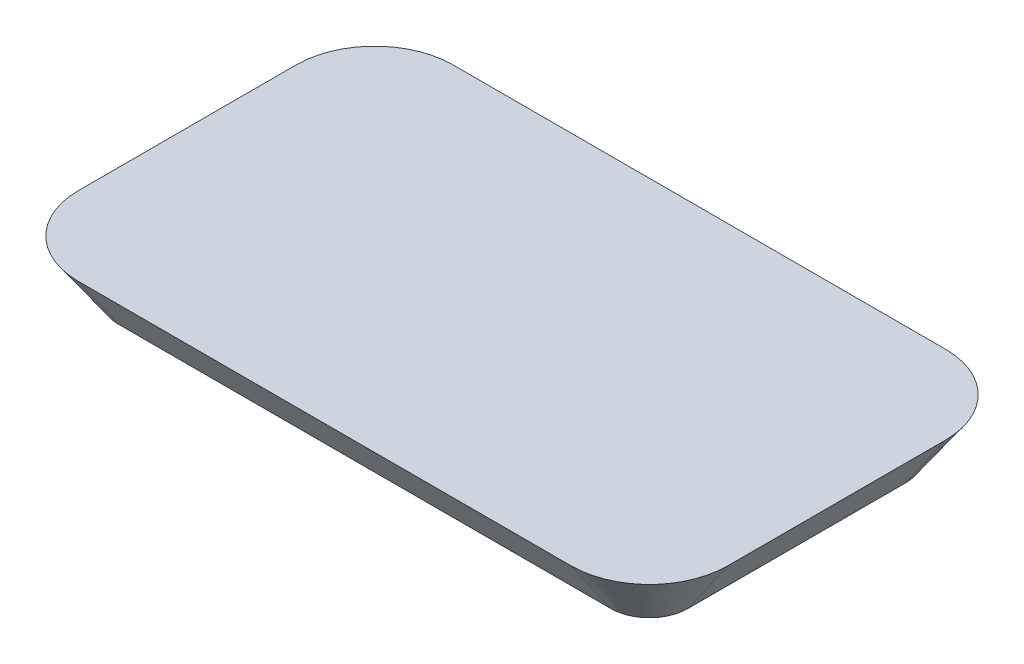
ISO-10303-21;
HEADER;
FILE_DESCRIPTION(('STEP AP214'),'2;1');
FILE_NAME('part.step','',(''),(''),'','','');
FILE_SCHEMA(('AUTOMOTIVE_DESIGN { 1 0 10303 214 1 1 1 1 }'));
ENDSEC;
DATA;
#1=APPLICATION_CONTEXT('core data for automotive mechanical design processes');
#2=APPLICATION_PROTOCOL_DEFINITION('international standard','automotive_design',2000,#1);
#3=PRODUCT_CONTEXT('',#1,'mechanical');
#4=PRODUCT('Part','Part','',(#3));
#5=PRODUCT_RELATED_PRODUCT_CATEGORY('part','',(#4));
#6=PRODUCT_DEFINITION_FORMATION('','',#4);
#7=PRODUCT_DEFINITION_CONTEXT('part definition',#1,'design');
#8=PRODUCT_DEFINITION('design','',#6,#7);
#9=PRODUCT_DEFINITION_SHAPE('','',#8);
#10=(LENGTH_UNIT() NAMED_UNIT(*) SI_UNIT(.MILLI.,.METRE.));
#11=(NAMED_UNIT(*) PLANE_ANGLE_UNIT() SI_UNIT($,.RADIAN.));
#12=(NAMED_UNIT(*) SI_UNIT($,.STERADIAN.) SOLID_ANGLE_UNIT());
#13=UNCERTAINTY_MEASURE_WITH_UNIT(LENGTH_MEASURE(1.E-05),#10,'distance_accuracy_value','');
#14=(GEOMETRIC_REPRESENTATION_CONTEXT(3) GLOBAL_UNCERTAINTY_ASSIGNED_CONTEXT((#13)) GLOBAL_UNIT_ASSIGNED_CONTEXT((#10,
#11,#12)) REPRESENTATION_CONTEXT('',''));
#15=CARTESIAN_POINT('',(0.,0.,0.));
#16=DIRECTION('',(0.,0.,1.));
#17=DIRECTION('',(1.,0.,0.));
#18=AXIS2_PLACEMENT_3D('',#15,#16,#17);
#19=CARTESIAN_POINT('',(34.5,0.,-15.25));
#20=DIRECTION('',(0.,1.,0.));
#21=DIRECTION('',(0.,0.,-1.));
#22=AXIS2_PLACEMENT_3D('',#19,#20,#21);
#23=CONICAL_SURFACE('',#22,11.,0.610865238198017);
#24=CARTESIAN_POINT('',(34.5,0.,-15.25));
#25=DIRECTION('',(0.,1.,0.));
#26=DIRECTION('',(0.,0.,-1.));
#27=AXIS2_PLACEMENT_3D('',#24,#25,#26);
#28=CIRCLE('',#27,11.);
#29=CARTESIAN_POINT('',(45.5,0.,-15.25));
#30=VERTEX_POINT('',#29);
#31=CARTESIAN_POINT('',(34.5,0.,-26.25));
#32=VERTEX_POINT('',#31);
#33=EDGE_CURVE('E116',#30,#32,#28,.T.);
#34=ORIENTED_EDGE('',*,*,#33,.F.);
#35=DIRECTION('',(0.573576436351047,0.819152044288991,0.));
#36=VECTOR('',#35,1.);
#37=CARTESIAN_POINT('',(45.5,0.,-15.25));
#38=LINE('',#37,#36);
#39=CARTESIAN_POINT('',(39.8983396943223,-8.,-15.25));
#40=VERTEX_POINT('',#39);
#41=EDGE_CURVE('E11',#40,#30,#38,.T.);
#42=ORIENTED_EDGE('',*,*,#41,.F.);
#43=CARTESIAN_POINT('',(34.5,-8.,-15.25));
#44=DIRECTION('',(0.,-1.,0.));
#45=DIRECTION('',(0.,0.,-1.));
#46=AXIS2_PLACEMENT_3D('',#43,#44,#45);
#47=CIRCLE('',#46,5.39833969432229);
#48=CARTESIAN_POINT('',(34.5,-8.,-20.6483396943223));
#49=VERTEX_POINT('',#48);
#50=EDGE_CURVE('E118',#40,#49,#47,.F.);
#51=ORIENTED_EDGE('',*,*,#50,.T.);
#52=DIRECTION('',(0.,0.819152044288991,-0.573576436351047));
#53=VECTOR('',#52,1.);
#54=CARTESIAN_POINT('',(34.5,0.,-26.25));
#55=LINE('',#54,#53);
#56=EDGE_CURVE('E88',#49,#32,#55,.T.);
#57=ORIENTED_EDGE('',*,*,#56,.T.);
#58=EDGE_LOOP('',(#34,#42,#51,#57));
#59=FACE_BOUND('',#58,.T.);
#60=ADVANCED_FACE('F39',(#59),#23,.T.);
#61=CARTESIAN_POINT('',(45.5,0.,-15.25));
#62=DIRECTION('',(0.819152044288991,-0.573576436351047,0.));
#63=DIRECTION('',(0.573576436351047,0.819152044288991,0.));
#64=AXIS2_PLACEMENT_3D('',#61,#62,#63);
#65=PLANE('',#64);
#66=DIRECTION('',(0.,0.,-1.));
#67=VECTOR('',#66,1.);
#68=CARTESIAN_POINT('',(45.5,0.,-15.25));
#69=LINE('',#68,#67);
#70=CARTESIAN_POINT('',(45.5,0.,15.25));
#71=VERTEX_POINT('',#70);
#72=EDGE_CURVE('E129',#71,#30,#69,.T.);
#73=ORIENTED_EDGE('',*,*,#72,.F.);
#74=DIRECTION('',(0.573576436351047,0.819152044288991,0.));
#75=VECTOR('',#74,1.);
#76=CARTESIAN_POINT('',(45.5,0.,15.25));
#77=LINE('',#76,#75);
#78=CARTESIAN_POINT('',(39.8983396943223,-8.,15.25));
#79=VERTEX_POINT('',#78);
#80=EDGE_CURVE('E49',#79,#71,#77,.T.);
#81=ORIENTED_EDGE('',*,*,#80,.F.);
#82=DIRECTION('',(0.,0.,-1.));
#83=VECTOR('',#82,1.);
#84=CARTESIAN_POINT('',(39.8983396943223,-8.,-15.25));
#85=LINE('',#84,#83);
#86=EDGE_CURVE('E119',#79,#40,#85,.T.);
#87=ORIENTED_EDGE('',*,*,#86,.T.);
#88=ORIENTED_EDGE('',*,*,#41,.T.);
#89=EDGE_LOOP('',(#73,#81,#87,#88));
#90=FACE_BOUND('',#89,.T.);
#91=ADVANCED_FACE('F41',(#90),#65,.T.);
#92=CARTESIAN_POINT('',(34.5,0.,15.25));
#93=DIRECTION('',(0.,1.,0.));
#94=DIRECTION('',(0.,0.,1.));
#95=AXIS2_PLACEMENT_3D('',#92,#93,#94);
#96=CONICAL_SURFACE('',#95,11.,0.610865238198017);
#97=CARTESIAN_POINT('',(34.5,0.,15.25));
#98=DIRECTION('',(0.,1.,0.));
#99=DIRECTION('',(0.,0.,1.));
#100=AXIS2_PLACEMENT_3D('',#97,#98,#99);
#101=CIRCLE('',#100,11.);
#102=CARTESIAN_POINT('',(34.5,0.,26.25));
#103=VERTEX_POINT('',#102);
#104=EDGE_CURVE('E142',#103,#71,#101,.T.);
#105=ORIENTED_EDGE('',*,*,#104,.F.);
#106=DIRECTION('',(0.,0.819152044288991,0.573576436351047));
#107=VECTOR('',#106,1.);
#108=CARTESIAN_POINT('',(34.5,0.,26.25));
#109=LINE('',#108,#107);
#110=CARTESIAN_POINT('',(34.5,-8.,20.6483396943223));
#111=VERTEX_POINT('',#110);
#112=EDGE_CURVE('E152',#111,#103,#109,.T.);
#113=ORIENTED_EDGE('',*,*,#112,.F.);
#114=CARTESIAN_POINT('',(34.5,-8.,15.25));
#115=DIRECTION('',(0.,-1.,0.));
#116=DIRECTION('',(0.,0.,-1.));
#117=AXIS2_PLACEMENT_3D('',#114,#115,#116);
#118=CIRCLE('',#117,5.39833969432229);
#119=EDGE_CURVE('E157',#111,#79,#118,.F.);
#120=ORIENTED_EDGE('',*,*,#119,.T.);
#121=ORIENTED_EDGE('',*,*,#80,.T.);
#122=EDGE_LOOP('',(#105,#113,#120,#121));
#123=FACE_BOUND('',#122,.T.);
#124=ADVANCED_FACE('F185',(#123),#96,.T.);
#125=CARTESIAN_POINT('',(-34.5,0.,26.25));
#126=DIRECTION('',(0.,-0.573576436351047,0.819152044288991));
#127=DIRECTION('',(0.,-0.819152044288991,-0.573576436351047));
#128=AXIS2_PLACEMENT_3D('',#125,#126,#127);
#129=PLANE('',#128);
#130=DIRECTION('',(1.,0.,0.));
#131=VECTOR('',#130,1.);
#132=CARTESIAN_POINT('',(-34.5,0.,26.25));
#133=LINE('',#132,#131);
#134=CARTESIAN_POINT('',(-34.5,0.,26.25));
#135=VERTEX_POINT('',#134);
#136=EDGE_CURVE('E139',#135,#103,#133,.T.);
#137=ORIENTED_EDGE('',*,*,#136,.F.);
#138=DIRECTION('',(0.,0.819152044288991,0.573576436351047));
#139=VECTOR('',#138,1.);
#140=CARTESIAN_POINT('',(-34.5,0.,26.25));
#141=LINE('',#140,#139);
#142=CARTESIAN_POINT('',(-34.5,-8.,20.6483396943223));
#143=VERTEX_POINT('',#142);
#144=EDGE_CURVE('E150',#143,#135,#141,.T.);
#145=ORIENTED_EDGE('',*,*,#144,.F.);
#146=DIRECTION('',(1.,0.,0.));
#147=VECTOR('',#146,1.);
#148=CARTESIAN_POINT('',(-34.5,-8.,20.6483396943223));
#149=LINE('',#148,#147);
#150=EDGE_CURVE('E159',#143,#111,#149,.T.);
#151=ORIENTED_EDGE('',*,*,#150,.T.);
#152=ORIENTED_EDGE('',*,*,#112,.T.);
#153=EDGE_LOOP('',(#137,#145,#151,#152));
#154=FACE_BOUND('',#153,.T.);
#155=ADVANCED_FACE('F183',(#154),#129,.T.);
#156=CARTESIAN_POINT('',(-34.5,0.,15.25));
#157=DIRECTION('',(0.,1.,0.));
#158=DIRECTION('',(0.,0.,1.));
#159=AXIS2_PLACEMENT_3D('',#156,#157,#158);
#160=CONICAL_SURFACE('',#159,11.,0.610865238198017);
#161=CARTESIAN_POINT('',(-34.5,0.,15.25));
#162=DIRECTION('',(0.,1.,0.));
#163=DIRECTION('',(0.,0.,1.));
#164=AXIS2_PLACEMENT_3D('',#161,#162,#163);
#165=CIRCLE('',#164,11.);
#166=CARTESIAN_POINT('',(-45.5,0.,15.25));
#167=VERTEX_POINT('',#166);
#168=EDGE_CURVE('E136',#167,#135,#165,.T.);
#169=ORIENTED_EDGE('',*,*,#168,.F.);
#170=DIRECTION('',(-0.573576436351047,0.819152044288991,0.));
#171=VECTOR('',#170,1.);
#172=CARTESIAN_POINT('',(-45.5,0.,15.25));
#173=LINE('',#172,#171);
#174=CARTESIAN_POINT('',(-39.8983396943223,-8.,15.25));
#175=VERTEX_POINT('',#174);
#176=EDGE_CURVE('E148',#175,#167,#173,.T.);
#177=ORIENTED_EDGE('',*,*,#176,.F.);
#178=CARTESIAN_POINT('',(-34.5,-8.,15.25));
#179=DIRECTION('',(0.,-1.,0.));
#180=DIRECTION('',(0.,0.,-1.));
#181=AXIS2_PLACEMENT_3D('',#178,#179,#180);
#182=CIRCLE('',#181,5.39833969432229);
#183=EDGE_CURVE('E162',#175,#143,#182,.F.);
#184=ORIENTED_EDGE('',*,*,#183,.T.);
#185=ORIENTED_EDGE('',*,*,#144,.T.);
#186=EDGE_LOOP('',(#169,#177,#184,#185));
#187=FACE_BOUND('',#186,.T.);
#188=ADVANCED_FACE('F181',(#187),#160,.T.);
#189=CARTESIAN_POINT('',(-45.5,0.,-15.25));
#190=DIRECTION('',(-0.819152044288991,-0.573576436351047,0.));
#191=DIRECTION('',(0.573576436351047,-0.819152044288991,0.));
#192=AXIS2_PLACEMENT_3D('',#189,#190,#191);
#193=PLANE('',#192);
#194=DIRECTION('',(0.,0.,1.));
#195=VECTOR('',#194,1.);
#196=CARTESIAN_POINT('',(-45.5,0.,-15.25));
#197=LINE('',#196,#195);
#198=CARTESIAN_POINT('',(-45.5,0.,-15.25));
#199=VERTEX_POINT('',#198);
#200=EDGE_CURVE('E133',#199,#167,#197,.T.);
#201=ORIENTED_EDGE('',*,*,#200,.F.);
#202=DIRECTION('',(-0.573576436351047,0.819152044288991,0.));
#203=VECTOR('',#202,1.);
#204=CARTESIAN_POINT('',(-45.5,0.,-15.25));
#205=LINE('',#204,#203);
#206=CARTESIAN_POINT('',(-39.8983396943223,-8.,-15.25));
#207=VERTEX_POINT('',#206);
#208=EDGE_CURVE('E146',#207,#199,#205,.T.);
#209=ORIENTED_EDGE('',*,*,#208,.F.);
#210=DIRECTION('',(0.,0.,1.));
#211=VECTOR('',#210,1.);
#212=CARTESIAN_POINT('',(-39.8983396943223,-8.,-15.25));
#213=LINE('',#212,#211);
#214=EDGE_CURVE('E165',#207,#175,#213,.T.);
#215=ORIENTED_EDGE('',*,*,#214,.T.);
#216=ORIENTED_EDGE('',*,*,#176,.T.);
#217=EDGE_LOOP('',(#201,#209,#215,#216));
#218=FACE_BOUND('',#217,.T.);
#219=ADVANCED_FACE('F176',(#218),#193,.T.);
#220=CARTESIAN_POINT('',(-34.5,0.,-15.25));
#221=DIRECTION('',(0.,1.,0.));
#222=DIRECTION('',(0.,0.,1.));
#223=AXIS2_PLACEMENT_3D('',#220,#221,#222);
#224=CONICAL_SURFACE('',#223,11.,0.610865238198017);
#225=CARTESIAN_POINT('',(-34.5,0.,-15.25));
#226=DIRECTION('',(0.,1.,0.));
#227=DIRECTION('',(0.,0.,1.));
#228=AXIS2_PLACEMENT_3D('',#225,#226,#227);
#229=CIRCLE('',#228,11.);
#230=CARTESIAN_POINT('',(-34.5,0.,-26.25));
#231=VERTEX_POINT('',#230);
#232=EDGE_CURVE('E126',#231,#199,#229,.T.);
#233=ORIENTED_EDGE('',*,*,#232,.F.);
#234=DIRECTION('',(0.,0.819152044288991,-0.573576436351047));
#235=VECTOR('',#234,1.);
#236=CARTESIAN_POINT('',(-34.5,0.,-26.25));
#237=LINE('',#236,#235);
#238=CARTESIAN_POINT('',(-34.5,-8.,-20.6483396943223));
#239=VERTEX_POINT('',#238);
#240=EDGE_CURVE('E81',#239,#231,#237,.T.);
#241=ORIENTED_EDGE('',*,*,#240,.F.);
#242=CARTESIAN_POINT('',(-34.5,-8.,-15.25));
#243=DIRECTION('',(0.,-1.,0.));
#244=DIRECTION('',(0.,0.,-1.));
#245=AXIS2_PLACEMENT_3D('',#242,#243,#244);
#246=CIRCLE('',#245,5.39833969432229);
#247=EDGE_CURVE('E167',#239,#207,#246,.F.);
#248=ORIENTED_EDGE('',*,*,#247,.T.);
#249=ORIENTED_EDGE('',*,*,#208,.T.);
#250=EDGE_LOOP('',(#233,#241,#248,#249));
#251=FACE_BOUND('',#250,.T.);
#252=ADVANCED_FACE('F178',(#251),#224,.T.);
#253=CARTESIAN_POINT('',(-34.5,0.,-26.25));
#254=DIRECTION('',(0.,-0.573576436351047,-0.819152044288991));
#255=DIRECTION('',(0.,0.819152044288991,-0.573576436351047));
#256=AXIS2_PLACEMENT_3D('',#253,#254,#255);
#257=PLANE('',#256);
#258=DIRECTION('',(-1.,0.,0.));
#259=VECTOR('',#258,1.);
#260=CARTESIAN_POINT('',(-34.5,0.,-26.25));
#261=LINE('',#260,#259);
#262=EDGE_CURVE('E122',#32,#231,#261,.T.);
#263=ORIENTED_EDGE('',*,*,#262,.F.);
#264=ORIENTED_EDGE('',*,*,#56,.F.);
#265=DIRECTION('',(-1.,0.,0.));
#266=VECTOR('',#265,1.);
#267=CARTESIAN_POINT('',(-34.5,-8.,-20.6483396943223));
#268=LINE('',#267,#266);
#269=EDGE_CURVE('E43',#49,#239,#268,.T.);
#270=ORIENTED_EDGE('',*,*,#269,.T.);
#271=ORIENTED_EDGE('',*,*,#240,.T.);
#272=EDGE_LOOP('',(#263,#264,#270,#271));
#273=FACE_BOUND('',#272,.T.);
#274=ADVANCED_FACE('F123',(#273),#257,.T.);
#275=CARTESIAN_POINT('',(34.5,-8.,-15.25));
#276=DIRECTION('',(0.,-1.,0.));
#277=DIRECTION('',(0.,0.,-1.));
#278=AXIS2_PLACEMENT_3D('',#275,#276,#277);
#279=PLANE('',#278);
#280=ORIENTED_EDGE('',*,*,#50,.F.);
#281=ORIENTED_EDGE('',*,*,#86,.F.);
#282=ORIENTED_EDGE('',*,*,#119,.F.);
#283=ORIENTED_EDGE('',*,*,#150,.F.);
#284=ORIENTED_EDGE('',*,*,#183,.F.);
#285=ORIENTED_EDGE('',*,*,#214,.F.);
#286=ORIENTED_EDGE('',*,*,#247,.F.);
#287=ORIENTED_EDGE('',*,*,#269,.F.);
#288=EDGE_LOOP('',(#280,#281,#282,#283,#284,#285,#286,#287));
#289=FACE_BOUND('',#288,.T.);
#290=ADVANCED_FACE('F169',(#289),#279,.T.);
#291=CARTESIAN_POINT('',(34.5,0.,-15.25));
#292=DIRECTION('',(0.,-1.,0.));
#293=DIRECTION('',(0.,0.,-1.));
#294=AXIS2_PLACEMENT_3D('',#291,#292,#293);
#295=PLANE('',#294);
#296=ORIENTED_EDGE('',*,*,#33,.T.);
#297=ORIENTED_EDGE('',*,*,#262,.T.);
#298=ORIENTED_EDGE('',*,*,#232,.T.);
#299=ORIENTED_EDGE('',*,*,#200,.T.);
#300=ORIENTED_EDGE('',*,*,#168,.T.);
#301=ORIENTED_EDGE('',*,*,#136,.T.);
#302=ORIENTED_EDGE('',*,*,#104,.T.);
#303=ORIENTED_EDGE('',*,*,#72,.T.);
#304=EDGE_LOOP('',(#296,#297,#298,#299,#300,#301,#302,#303));
#305=FACE_BOUND('',#304,.T.);
#306=ADVANCED_FACE('F128',(#305),#295,.F.);
#307=CLOSED_SHELL('',(#60,#91,#124,#155,#188,#219,#252,#274,#290,#306));
#308=MANIFOLD_SOLID_BREP('B2',#307);
#309=ADVANCED_BREP_SHAPE_REPRESENTATION('',(#18,#308),#14);
#310=SHAPE_DEFINITION_REPRESENTATION(#9,#309);
ENDSEC;
END-ISO-10303-21;
